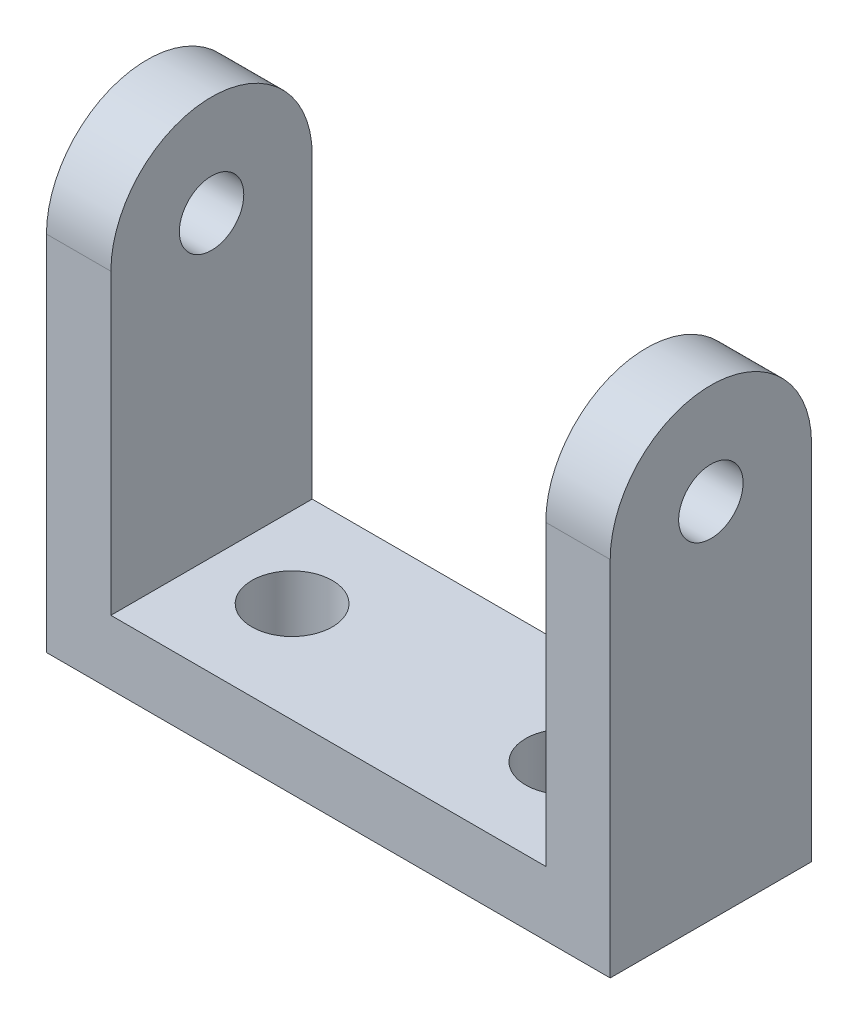
ISO-10303-21;
HEADER;
FILE_DESCRIPTION(('STEP AP214'),'2;1');
FILE_NAME('part.step','',(''),(''),'','','');
FILE_SCHEMA(('AUTOMOTIVE_DESIGN { 1 0 10303 214 1 1 1 1 }'));
ENDSEC;
DATA;
#1=APPLICATION_CONTEXT('core data for automotive mechanical design processes');
#2=APPLICATION_PROTOCOL_DEFINITION('international standard','automotive_design',2000,#1);
#3=PRODUCT_CONTEXT('',#1,'mechanical');
#4=PRODUCT('Part','Part','',(#3));
#5=PRODUCT_RELATED_PRODUCT_CATEGORY('part','',(#4));
#6=PRODUCT_DEFINITION_FORMATION('','',#4);
#7=PRODUCT_DEFINITION_CONTEXT('part definition',#1,'design');
#8=PRODUCT_DEFINITION('design','',#6,#7);
#9=PRODUCT_DEFINITION_SHAPE('','',#8);
#10=(LENGTH_UNIT() NAMED_UNIT(*) SI_UNIT(.MILLI.,.METRE.));
#11=(NAMED_UNIT(*) PLANE_ANGLE_UNIT() SI_UNIT($,.RADIAN.));
#12=(NAMED_UNIT(*) SI_UNIT($,.STERADIAN.) SOLID_ANGLE_UNIT());
#13=UNCERTAINTY_MEASURE_WITH_UNIT(LENGTH_MEASURE(1.E-05),#10,'distance_accuracy_value','');
#14=(GEOMETRIC_REPRESENTATION_CONTEXT(3) GLOBAL_UNCERTAINTY_ASSIGNED_CONTEXT((#13)) GLOBAL_UNIT_ASSIGNED_CONTEXT((#10,
#11,#12)) REPRESENTATION_CONTEXT('',''));
#15=CARTESIAN_POINT('',(0.,0.,0.));
#16=DIRECTION('',(0.,0.,1.));
#17=DIRECTION('',(1.,0.,0.));
#18=AXIS2_PLACEMENT_3D('',#15,#16,#17);
#19=CARTESIAN_POINT('',(-35.,45.,12.5));
#20=DIRECTION('',(1.,0.,0.));
#21=DIRECTION('',(0.,0.,-1.));
#22=AXIS2_PLACEMENT_3D('',#19,#20,#21);
#23=PLANE('',#22);
#24=CARTESIAN_POINT('',(-35.,45.,0.));
#25=DIRECTION('',(1.,0.,0.));
#26=DIRECTION('',(0.,0.,-1.));
#27=AXIS2_PLACEMENT_3D('',#24,#25,#26);
#28=CIRCLE('',#27,4.);
#29=CARTESIAN_POINT('',(-35.,45.,-4.));
#30=VERTEX_POINT('',#29);
#31=EDGE_CURVE('E217',#30,#30,#28,.T.);
#32=ORIENTED_EDGE('',*,*,#31,.T.);
#33=EDGE_LOOP('',(#32));
#34=FACE_BOUND('',#33,.T.);
#35=DIRECTION('',(0.,-1.,0.));
#36=VECTOR('',#35,1.);
#37=CARTESIAN_POINT('',(-35.,45.,12.5));
#38=LINE('',#37,#36);
#39=CARTESIAN_POINT('',(-35.,45.,12.5));
#40=VERTEX_POINT('',#39);
#41=CARTESIAN_POINT('',(-35.,0.,12.5));
#42=VERTEX_POINT('',#41);
#43=EDGE_CURVE('E159',#40,#42,#38,.T.);
#44=ORIENTED_EDGE('',*,*,#43,.F.);
#45=CARTESIAN_POINT('',(-35.,45.,0.));
#46=DIRECTION('',(1.,0.,0.));
#47=DIRECTION('',(0.,0.,-1.));
#48=AXIS2_PLACEMENT_3D('',#45,#46,#47);
#49=CIRCLE('',#48,12.5);
#50=CARTESIAN_POINT('',(-35.,45.,-12.5));
#51=VERTEX_POINT('',#50);
#52=EDGE_CURVE('E187',#51,#40,#49,.T.);
#53=ORIENTED_EDGE('',*,*,#52,.F.);
#54=DIRECTION('',(0.,-1.,0.));
#55=VECTOR('',#54,1.);
#56=CARTESIAN_POINT('',(-35.,45.,-12.5));
#57=LINE('',#56,#55);
#58=CARTESIAN_POINT('',(-35.,0.,-12.5));
#59=VERTEX_POINT('',#58);
#60=EDGE_CURVE('E134',#51,#59,#57,.T.);
#61=ORIENTED_EDGE('',*,*,#60,.T.);
#62=DIRECTION('',(0.,0.,-1.));
#63=VECTOR('',#62,1.);
#64=CARTESIAN_POINT('',(-35.,0.,12.5));
#65=LINE('',#64,#63);
#66=EDGE_CURVE('E11',#42,#59,#65,.T.);
#67=ORIENTED_EDGE('',*,*,#66,.F.);
#68=EDGE_LOOP('',(#44,#53,#61,#67));
#69=FACE_BOUND('',#68,.T.);
#70=ADVANCED_FACE('F39',(#34,#69),#23,.F.);
#71=CARTESIAN_POINT('',(-35.,0.,12.5));
#72=DIRECTION('',(0.,1.,0.));
#73=DIRECTION('',(0.,0.,1.));
#74=AXIS2_PLACEMENT_3D('',#71,#72,#73);
#75=PLANE('',#74);
#76=CARTESIAN_POINT('',(-17.,0.,0.));
#77=DIRECTION('',(0.,1.,0.));
#78=DIRECTION('',(-1.,0.,0.));
#79=AXIS2_PLACEMENT_3D('',#76,#77,#78);
#80=CIRCLE('',#79,5.);
#81=CARTESIAN_POINT('',(-22.,0.,0.));
#82=VERTEX_POINT('',#81);
#83=EDGE_CURVE('E226',#82,#82,#80,.T.);
#84=ORIENTED_EDGE('',*,*,#83,.T.);
#85=EDGE_LOOP('',(#84));
#86=FACE_BOUND('',#85,.T.);
#87=CARTESIAN_POINT('',(17.,0.,0.));
#88=DIRECTION('',(0.,1.,0.));
#89=DIRECTION('',(-1.,0.,0.));
#90=AXIS2_PLACEMENT_3D('',#87,#88,#89);
#91=CIRCLE('',#90,5.);
#92=CARTESIAN_POINT('',(12.,0.,0.));
#93=VERTEX_POINT('',#92);
#94=EDGE_CURVE('E231',#93,#93,#91,.T.);
#95=ORIENTED_EDGE('',*,*,#94,.T.);
#96=EDGE_LOOP('',(#95));
#97=FACE_BOUND('',#96,.T.);
#98=DIRECTION('',(1.,0.,0.));
#99=VECTOR('',#98,1.);
#100=CARTESIAN_POINT('',(-35.,0.,-12.5));
#101=LINE('',#100,#99);
#102=CARTESIAN_POINT('',(35.,0.,-12.5));
#103=VERTEX_POINT('',#102);
#104=EDGE_CURVE('E138',#59,#103,#101,.T.);
#105=ORIENTED_EDGE('',*,*,#104,.T.);
#106=DIRECTION('',(0.,0.,-1.));
#107=VECTOR('',#106,1.);
#108=CARTESIAN_POINT('',(35.,0.,12.5));
#109=LINE('',#108,#107);
#110=CARTESIAN_POINT('',(35.,0.,12.5));
#111=VERTEX_POINT('',#110);
#112=EDGE_CURVE('E49',#111,#103,#109,.T.);
#113=ORIENTED_EDGE('',*,*,#112,.F.);
#114=DIRECTION('',(1.,0.,0.));
#115=VECTOR('',#114,1.);
#116=CARTESIAN_POINT('',(-35.,0.,12.5));
#117=LINE('',#116,#115);
#118=EDGE_CURVE('E96',#42,#111,#117,.T.);
#119=ORIENTED_EDGE('',*,*,#118,.F.);
#120=ORIENTED_EDGE('',*,*,#66,.T.);
#121=EDGE_LOOP('',(#105,#113,#119,#120));
#122=FACE_BOUND('',#121,.T.);
#123=ADVANCED_FACE('F243',(#86,#97,#122),#75,.F.);
#124=CARTESIAN_POINT('',(35.,0.,12.5));
#125=DIRECTION('',(-1.,0.,0.));
#126=DIRECTION('',(0.,0.,1.));
#127=AXIS2_PLACEMENT_3D('',#124,#125,#126);
#128=PLANE('',#127);
#129=CARTESIAN_POINT('',(35.,45.,0.));
#130=DIRECTION('',(1.,0.,0.));
#131=DIRECTION('',(0.,0.,-1.));
#132=AXIS2_PLACEMENT_3D('',#129,#130,#131);
#133=CIRCLE('',#132,4.);
#134=CARTESIAN_POINT('',(35.,45.,-4.));
#135=VERTEX_POINT('',#134);
#136=EDGE_CURVE('E222',#135,#135,#133,.T.);
#137=ORIENTED_EDGE('',*,*,#136,.F.);
#138=EDGE_LOOP('',(#137));
#139=FACE_BOUND('',#138,.T.);
#140=DIRECTION('',(0.,1.,0.));
#141=VECTOR('',#140,1.);
#142=CARTESIAN_POINT('',(35.,0.,-12.5));
#143=LINE('',#142,#141);
#144=CARTESIAN_POINT('',(35.,45.,-12.5));
#145=VERTEX_POINT('',#144);
#146=EDGE_CURVE('E142',#103,#145,#143,.T.);
#147=ORIENTED_EDGE('',*,*,#146,.T.);
#148=CARTESIAN_POINT('',(35.,45.,0.));
#149=DIRECTION('',(1.,0.,0.));
#150=DIRECTION('',(0.,0.,-1.));
#151=AXIS2_PLACEMENT_3D('',#148,#149,#150);
#152=CIRCLE('',#151,12.5);
#153=CARTESIAN_POINT('',(35.,45.,12.5));
#154=VERTEX_POINT('',#153);
#155=EDGE_CURVE('E139',#145,#154,#152,.T.);
#156=ORIENTED_EDGE('',*,*,#155,.T.);
#157=DIRECTION('',(0.,1.,0.));
#158=VECTOR('',#157,1.);
#159=CARTESIAN_POINT('',(35.,0.,12.5));
#160=LINE('',#159,#158);
#161=EDGE_CURVE('E171',#111,#154,#160,.T.);
#162=ORIENTED_EDGE('',*,*,#161,.F.);
#163=ORIENTED_EDGE('',*,*,#112,.T.);
#164=EDGE_LOOP('',(#147,#156,#162,#163));
#165=FACE_BOUND('',#164,.T.);
#166=ADVANCED_FACE('F168',(#139,#165),#128,.F.);
#167=CARTESIAN_POINT('',(27.,45.,12.5));
#168=DIRECTION('',(1.,0.,0.));
#169=DIRECTION('',(0.,1.,0.));
#170=AXIS2_PLACEMENT_3D('',#167,#168,#169);
#171=PLANE('',#170);
#172=CARTESIAN_POINT('',(27.,45.,0.));
#173=DIRECTION('',(1.,0.,0.));
#174=DIRECTION('',(0.,1.,0.));
#175=AXIS2_PLACEMENT_3D('',#172,#173,#174);
#176=CIRCLE('',#175,4.);
#177=CARTESIAN_POINT('',(27.,49.,0.));
#178=VERTEX_POINT('',#177);
#179=EDGE_CURVE('E208',#178,#178,#176,.T.);
#180=ORIENTED_EDGE('',*,*,#179,.T.);
#181=EDGE_LOOP('',(#180));
#182=FACE_BOUND('',#181,.T.);
#183=DIRECTION('',(0.,-1.,0.));
#184=VECTOR('',#183,1.);
#185=CARTESIAN_POINT('',(27.,45.,12.5));
#186=LINE('',#185,#184);
#187=CARTESIAN_POINT('',(27.,45.,12.5));
#188=VERTEX_POINT('',#187);
#189=CARTESIAN_POINT('',(27.,8.,12.5));
#190=VERTEX_POINT('',#189);
#191=EDGE_CURVE('E116',#188,#190,#186,.T.);
#192=ORIENTED_EDGE('',*,*,#191,.F.);
#193=CARTESIAN_POINT('',(27.,45.,0.));
#194=DIRECTION('',(1.,0.,0.));
#195=DIRECTION('',(0.,0.,-1.));
#196=AXIS2_PLACEMENT_3D('',#193,#194,#195);
#197=CIRCLE('',#196,12.5);
#198=CARTESIAN_POINT('',(27.,45.,-12.5));
#199=VERTEX_POINT('',#198);
#200=EDGE_CURVE('E184',#199,#188,#197,.T.);
#201=ORIENTED_EDGE('',*,*,#200,.F.);
#202=DIRECTION('',(0.,-1.,0.));
#203=VECTOR('',#202,1.);
#204=CARTESIAN_POINT('',(27.,45.,-12.5));
#205=LINE('',#204,#203);
#206=CARTESIAN_POINT('',(27.,8.,-12.5));
#207=VERTEX_POINT('',#206);
#208=EDGE_CURVE('E149',#199,#207,#205,.T.);
#209=ORIENTED_EDGE('',*,*,#208,.T.);
#210=DIRECTION('',(0.,0.,-1.));
#211=VECTOR('',#210,1.);
#212=CARTESIAN_POINT('',(27.,8.,12.5));
#213=LINE('',#212,#211);
#214=EDGE_CURVE('E123',#190,#207,#213,.T.);
#215=ORIENTED_EDGE('',*,*,#214,.F.);
#216=EDGE_LOOP('',(#192,#201,#209,#215));
#217=FACE_BOUND('',#216,.T.);
#218=ADVANCED_FACE('F201',(#182,#217),#171,.F.);
#219=CARTESIAN_POINT('',(27.,8.,12.5));
#220=DIRECTION('',(0.,-1.,0.));
#221=DIRECTION('',(1.,0.,0.));
#222=AXIS2_PLACEMENT_3D('',#219,#220,#221);
#223=PLANE('',#222);
#224=CARTESIAN_POINT('',(-17.,7.99999999999999,0.));
#225=DIRECTION('',(0.,1.,0.));
#226=DIRECTION('',(-1.,0.,0.));
#227=AXIS2_PLACEMENT_3D('',#224,#225,#226);
#228=CIRCLE('',#227,5.);
#229=CARTESIAN_POINT('',(-22.,7.99999999999999,0.));
#230=VERTEX_POINT('',#229);
#231=EDGE_CURVE('E235',#230,#230,#228,.T.);
#232=ORIENTED_EDGE('',*,*,#231,.F.);
#233=EDGE_LOOP('',(#232));
#234=FACE_BOUND('',#233,.T.);
#235=CARTESIAN_POINT('',(17.,8.,0.));
#236=DIRECTION('',(0.,1.,0.));
#237=DIRECTION('',(-1.,0.,0.));
#238=AXIS2_PLACEMENT_3D('',#235,#236,#237);
#239=CIRCLE('',#238,5.);
#240=CARTESIAN_POINT('',(12.,8.,0.));
#241=VERTEX_POINT('',#240);
#242=EDGE_CURVE('E227',#241,#241,#239,.T.);
#243=ORIENTED_EDGE('',*,*,#242,.F.);
#244=EDGE_LOOP('',(#243));
#245=FACE_BOUND('',#244,.T.);
#246=DIRECTION('',(-1.,0.,0.));
#247=VECTOR('',#246,1.);
#248=CARTESIAN_POINT('',(27.,8.,-12.5));
#249=LINE('',#248,#247);
#250=CARTESIAN_POINT('',(-27.,7.99999999999999,-12.5));
#251=VERTEX_POINT('',#250);
#252=EDGE_CURVE('E81',#207,#251,#249,.T.);
#253=ORIENTED_EDGE('',*,*,#252,.T.);
#254=DIRECTION('',(0.,0.,-1.));
#255=VECTOR('',#254,1.);
#256=CARTESIAN_POINT('',(-27.,7.99999999999999,12.5));
#257=LINE('',#256,#255);
#258=CARTESIAN_POINT('',(-27.,7.99999999999999,12.5));
#259=VERTEX_POINT('',#258);
#260=EDGE_CURVE('E120',#259,#251,#257,.T.);
#261=ORIENTED_EDGE('',*,*,#260,.F.);
#262=DIRECTION('',(-1.,0.,0.));
#263=VECTOR('',#262,1.);
#264=CARTESIAN_POINT('',(27.,8.,12.5));
#265=LINE('',#264,#263);
#266=EDGE_CURVE('E111',#190,#259,#265,.T.);
#267=ORIENTED_EDGE('',*,*,#266,.F.);
#268=ORIENTED_EDGE('',*,*,#214,.T.);
#269=EDGE_LOOP('',(#253,#261,#267,#268));
#270=FACE_BOUND('',#269,.T.);
#271=ADVANCED_FACE('F121',(#234,#245,#270),#223,.F.);
#272=CARTESIAN_POINT('',(-27.,7.99999999999999,12.5));
#273=DIRECTION('',(-1.,0.,0.));
#274=DIRECTION('',(0.,0.,1.));
#275=AXIS2_PLACEMENT_3D('',#272,#273,#274);
#276=PLANE('',#275);
#277=CARTESIAN_POINT('',(-27.,45.,0.));
#278=DIRECTION('',(-1.,0.,0.));
#279=DIRECTION('',(0.,0.,1.));
#280=AXIS2_PLACEMENT_3D('',#277,#278,#279);
#281=CIRCLE('',#280,4.);
#282=CARTESIAN_POINT('',(-27.,45.,4.));
#283=VERTEX_POINT('',#282);
#284=EDGE_CURVE('E42',#283,#283,#281,.T.);
#285=ORIENTED_EDGE('',*,*,#284,.T.);
#286=EDGE_LOOP('',(#285));
#287=FACE_BOUND('',#286,.T.);
#288=DIRECTION('',(0.,1.,0.));
#289=VECTOR('',#288,1.);
#290=CARTESIAN_POINT('',(-27.,7.99999999999999,-12.5));
#291=LINE('',#290,#289);
#292=CARTESIAN_POINT('',(-27.,45.,-12.5));
#293=VERTEX_POINT('',#292);
#294=EDGE_CURVE('E88',#251,#293,#291,.T.);
#295=ORIENTED_EDGE('',*,*,#294,.T.);
#296=CARTESIAN_POINT('',(-27.,45.,0.));
#297=DIRECTION('',(1.,0.,0.));
#298=DIRECTION('',(0.,0.,-1.));
#299=AXIS2_PLACEMENT_3D('',#296,#297,#298);
#300=CIRCLE('',#299,12.5);
#301=CARTESIAN_POINT('',(-27.,45.,12.5));
#302=VERTEX_POINT('',#301);
#303=EDGE_CURVE('E127',#293,#302,#300,.T.);
#304=ORIENTED_EDGE('',*,*,#303,.T.);
#305=DIRECTION('',(0.,1.,0.));
#306=VECTOR('',#305,1.);
#307=CARTESIAN_POINT('',(-27.,7.99999999999999,12.5));
#308=LINE('',#307,#306);
#309=EDGE_CURVE('E114',#259,#302,#308,.T.);
#310=ORIENTED_EDGE('',*,*,#309,.F.);
#311=ORIENTED_EDGE('',*,*,#260,.T.);
#312=EDGE_LOOP('',(#295,#304,#310,#311));
#313=FACE_BOUND('',#312,.T.);
#314=ADVANCED_FACE('F125',(#287,#313),#276,.F.);
#315=CARTESIAN_POINT('',(0.,0.,12.5));
#316=DIRECTION('',(0.,0.,1.));
#317=DIRECTION('',(1.,0.,0.));
#318=AXIS2_PLACEMENT_3D('',#315,#316,#317);
#319=PLANE('',#318);
#320=ORIENTED_EDGE('',*,*,#43,.T.);
#321=ORIENTED_EDGE('',*,*,#118,.T.);
#322=ORIENTED_EDGE('',*,*,#161,.T.);
#323=DIRECTION('',(-1.,0.,0.));
#324=VECTOR('',#323,1.);
#325=CARTESIAN_POINT('',(35.,45.,12.5));
#326=LINE('',#325,#324);
#327=EDGE_CURVE('E182',#154,#188,#326,.T.);
#328=ORIENTED_EDGE('',*,*,#327,.T.);
#329=ORIENTED_EDGE('',*,*,#191,.T.);
#330=ORIENTED_EDGE('',*,*,#266,.T.);
#331=ORIENTED_EDGE('',*,*,#309,.T.);
#332=DIRECTION('',(-1.,0.,0.));
#333=VECTOR('',#332,1.);
#334=CARTESIAN_POINT('',(-27.,45.,12.5));
#335=LINE('',#334,#333);
#336=EDGE_CURVE('E57',#302,#40,#335,.T.);
#337=ORIENTED_EDGE('',*,*,#336,.T.);
#338=EDGE_LOOP('',(#320,#321,#322,#328,#329,#330,#331,#337));
#339=FACE_BOUND('',#338,.T.);
#340=ADVANCED_FACE('F112',(#339),#319,.T.);
#341=CARTESIAN_POINT('',(0.,0.,-12.5));
#342=DIRECTION('',(0.,0.,1.));
#343=DIRECTION('',(1.,0.,0.));
#344=AXIS2_PLACEMENT_3D('',#341,#342,#343);
#345=PLANE('',#344);
#346=ORIENTED_EDGE('',*,*,#60,.F.);
#347=DIRECTION('',(-1.,0.,0.));
#348=VECTOR('',#347,1.);
#349=CARTESIAN_POINT('',(-27.,45.,-12.5));
#350=LINE('',#349,#348);
#351=EDGE_CURVE('E156',#293,#51,#350,.T.);
#352=ORIENTED_EDGE('',*,*,#351,.F.);
#353=ORIENTED_EDGE('',*,*,#294,.F.);
#354=ORIENTED_EDGE('',*,*,#252,.F.);
#355=ORIENTED_EDGE('',*,*,#208,.F.);
#356=DIRECTION('',(-1.,0.,0.));
#357=VECTOR('',#356,1.);
#358=CARTESIAN_POINT('',(35.,45.,-12.5));
#359=LINE('',#358,#357);
#360=EDGE_CURVE('E145',#145,#199,#359,.T.);
#361=ORIENTED_EDGE('',*,*,#360,.F.);
#362=ORIENTED_EDGE('',*,*,#146,.F.);
#363=ORIENTED_EDGE('',*,*,#104,.F.);
#364=EDGE_LOOP('',(#346,#352,#353,#354,#355,#361,#362,#363));
#365=FACE_BOUND('',#364,.T.);
#366=ADVANCED_FACE('F174',(#365),#345,.F.);
#367=CARTESIAN_POINT('',(35.,45.,0.));
#368=DIRECTION('',(-1.,0.,0.));
#369=DIRECTION('',(0.,0.,1.));
#370=AXIS2_PLACEMENT_3D('',#367,#368,#369);
#371=CYLINDRICAL_SURFACE('',#370,12.5);
#372=ORIENTED_EDGE('',*,*,#200,.T.);
#373=ORIENTED_EDGE('',*,*,#327,.F.);
#374=ORIENTED_EDGE('',*,*,#155,.F.);
#375=ORIENTED_EDGE('',*,*,#360,.T.);
#376=EDGE_LOOP('',(#372,#373,#374,#375));
#377=FACE_BOUND('',#376,.T.);
#378=ADVANCED_FACE('F181',(#377),#371,.T.);
#379=CARTESIAN_POINT('',(-35.,45.,0.));
#380=DIRECTION('',(1.,0.,0.));
#381=DIRECTION('',(0.,0.,-1.));
#382=AXIS2_PLACEMENT_3D('',#379,#380,#381);
#383=CYLINDRICAL_SURFACE('',#382,12.5);
#384=ORIENTED_EDGE('',*,*,#52,.T.);
#385=ORIENTED_EDGE('',*,*,#336,.F.);
#386=ORIENTED_EDGE('',*,*,#303,.F.);
#387=ORIENTED_EDGE('',*,*,#351,.T.);
#388=EDGE_LOOP('',(#384,#385,#386,#387));
#389=FACE_BOUND('',#388,.T.);
#390=ADVANCED_FACE('F206',(#389),#383,.T.);
#391=CARTESIAN_POINT('',(-35.,45.,0.));
#392=DIRECTION('',(1.,0.,0.));
#393=DIRECTION('',(0.,0.,-1.));
#394=AXIS2_PLACEMENT_3D('',#391,#392,#393);
#395=CYLINDRICAL_SURFACE('',#394,4.);
#396=ORIENTED_EDGE('',*,*,#31,.F.);
#397=EDGE_LOOP('',(#396));
#398=FACE_BOUND('',#397,.T.);
#399=ORIENTED_EDGE('',*,*,#284,.F.);
#400=EDGE_LOOP('',(#399));
#401=FACE_BOUND('',#400,.T.);
#402=ADVANCED_FACE('F265',(#398,#401),#395,.F.);
#403=ORIENTED_EDGE('',*,*,#136,.T.);
#404=EDGE_LOOP('',(#403));
#405=FACE_BOUND('',#404,.T.);
#406=ORIENTED_EDGE('',*,*,#179,.F.);
#407=EDGE_LOOP('',(#406));
#408=FACE_BOUND('',#407,.T.);
#409=ADVANCED_FACE('F259',(#405,#408),#395,.F.);
#410=CARTESIAN_POINT('',(17.,0.,0.));
#411=DIRECTION('',(0.,1.,0.));
#412=DIRECTION('',(-1.,0.,0.));
#413=AXIS2_PLACEMENT_3D('',#410,#411,#412);
#414=CYLINDRICAL_SURFACE('',#413,5.);
#415=ORIENTED_EDGE('',*,*,#94,.F.);
#416=EDGE_LOOP('',(#415));
#417=FACE_BOUND('',#416,.T.);
#418=ORIENTED_EDGE('',*,*,#242,.T.);
#419=EDGE_LOOP('',(#418));
#420=FACE_BOUND('',#419,.T.);
#421=ADVANCED_FACE('F249',(#417,#420),#414,.F.);
#422=CARTESIAN_POINT('',(-17.,0.,0.));
#423=DIRECTION('',(0.,1.,0.));
#424=DIRECTION('',(-1.,0.,0.));
#425=AXIS2_PLACEMENT_3D('',#422,#423,#424);
#426=CYLINDRICAL_SURFACE('',#425,5.);
#427=ORIENTED_EDGE('',*,*,#83,.F.);
#428=EDGE_LOOP('',(#427));
#429=FACE_BOUND('',#428,.T.);
#430=ORIENTED_EDGE('',*,*,#231,.T.);
#431=EDGE_LOOP('',(#430));
#432=FACE_BOUND('',#431,.T.);
#433=ADVANCED_FACE('F246',(#429,#432),#426,.F.);
#434=CLOSED_SHELL('',(#70,#123,#166,#218,#271,#314,#340,#366,#378,#390,#402,#409,#421,#433));
#435=MANIFOLD_SOLID_BREP('B2',#434);
#436=ADVANCED_BREP_SHAPE_REPRESENTATION('',(#18,#435),#14);
#437=SHAPE_DEFINITION_REPRESENTATION(#9,#436);
ENDSEC;
END-ISO-10303-21;
